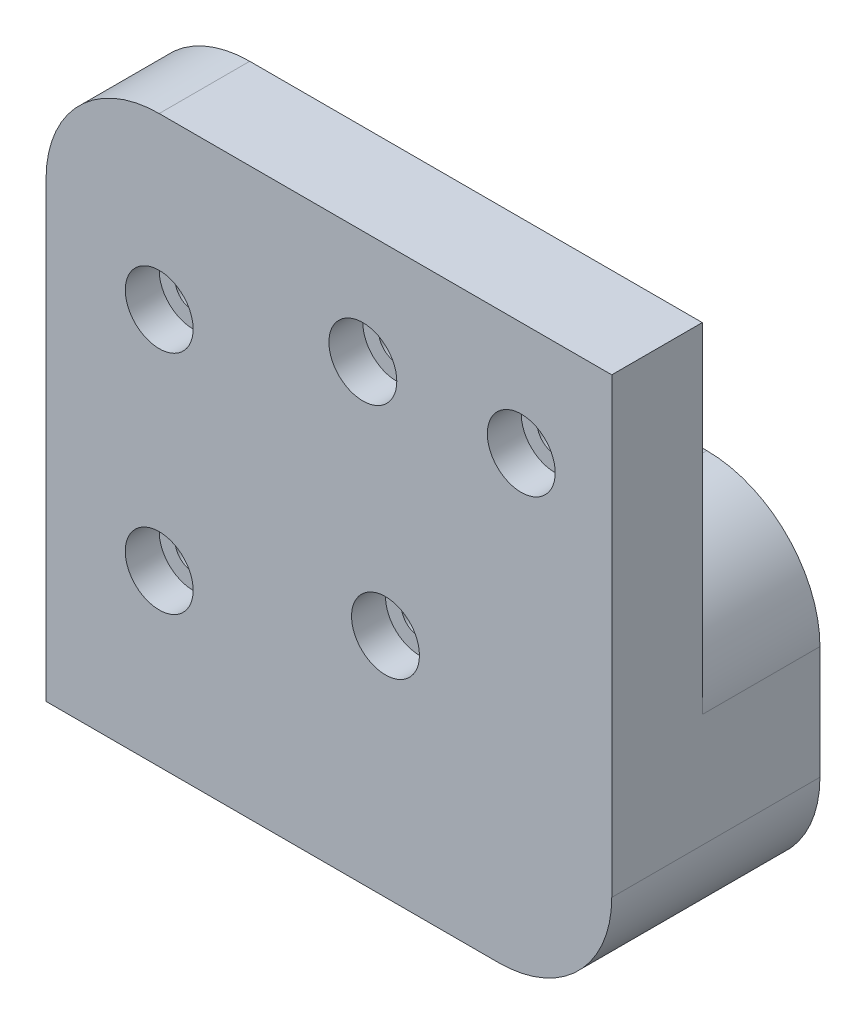
ISO-10303-21;
HEADER;
FILE_DESCRIPTION(('STEP AP214'),'2;1');
FILE_NAME('part.step','',(''),(''),'','','');
FILE_SCHEMA(('AUTOMOTIVE_DESIGN { 1 0 10303 214 1 1 1 1 }'));
ENDSEC;
DATA;
#1=APPLICATION_CONTEXT('core data for automotive mechanical design processes');
#2=APPLICATION_PROTOCOL_DEFINITION('international standard','automotive_design',2000,#1);
#3=PRODUCT_CONTEXT('',#1,'mechanical');
#4=PRODUCT('Part','Part','',(#3));
#5=PRODUCT_RELATED_PRODUCT_CATEGORY('part','',(#4));
#6=PRODUCT_DEFINITION_FORMATION('','',#4);
#7=PRODUCT_DEFINITION_CONTEXT('part definition',#1,'design');
#8=PRODUCT_DEFINITION('design','',#6,#7);
#9=PRODUCT_DEFINITION_SHAPE('','',#8);
#10=(LENGTH_UNIT() NAMED_UNIT(*) SI_UNIT(.MILLI.,.METRE.));
#11=(NAMED_UNIT(*) PLANE_ANGLE_UNIT() SI_UNIT($,.RADIAN.));
#12=(NAMED_UNIT(*) SI_UNIT($,.STERADIAN.) SOLID_ANGLE_UNIT());
#13=UNCERTAINTY_MEASURE_WITH_UNIT(LENGTH_MEASURE(1.E-05),#10,'distance_accuracy_value','');
#14=(GEOMETRIC_REPRESENTATION_CONTEXT(3) GLOBAL_UNCERTAINTY_ASSIGNED_CONTEXT((#13)) GLOBAL_UNIT_ASSIGNED_CONTEXT((#10,
#11,#12)) REPRESENTATION_CONTEXT('',''));
#15=CARTESIAN_POINT('',(0.,0.,0.));
#16=DIRECTION('',(0.,0.,1.));
#17=DIRECTION('',(1.,0.,0.));
#18=AXIS2_PLACEMENT_3D('',#15,#16,#17);
#19=CARTESIAN_POINT('',(20.,47.5288390266744,-52.8263560710908));
#20=DIRECTION('',(0.,0.,1.));
#21=DIRECTION('',(1.,0.,0.));
#22=AXIS2_PLACEMENT_3D('',#19,#20,#21);
#23=CYLINDRICAL_SURFACE('',#22,1.60000000000001);
#24=CARTESIAN_POINT('',(20.,47.5288390266744,-10.399949199898));
#25=DIRECTION('',(0.,0.,1.));
#26=DIRECTION('',(1.,0.,0.));
#27=AXIS2_PLACEMENT_3D('',#24,#25,#26);
#28=CIRCLE('',#27,1.60000000000001);
#29=CARTESIAN_POINT('',(21.6,47.5288390266744,-10.399949199898));
#30=VERTEX_POINT('',#29);
#31=EDGE_CURVE('E206',#30,#30,#28,.F.);
#32=ORIENTED_EDGE('',*,*,#31,.T.);
#33=EDGE_LOOP('',(#32));
#34=FACE_BOUND('',#33,.T.);
#35=CARTESIAN_POINT('',(20.,47.5288390266744,5.));
#36=DIRECTION('',(0.,0.,1.));
#37=DIRECTION('',(1.,0.,0.));
#38=AXIS2_PLACEMENT_3D('',#35,#36,#37);
#39=CIRCLE('',#38,1.60000000000001);
#40=CARTESIAN_POINT('',(21.6,47.5288390266744,5.));
#41=VERTEX_POINT('',#40);
#42=EDGE_CURVE('E163',#41,#41,#39,.F.);
#43=ORIENTED_EDGE('',*,*,#42,.F.);
#44=EDGE_LOOP('',(#43));
#45=FACE_BOUND('',#44,.T.);
#46=ADVANCED_FACE('F51',(#34,#45),#23,.F.);
#47=CARTESIAN_POINT('',(32.,67.5,8.));
#48=DIRECTION('',(0.,0.,-1.));
#49=DIRECTION('',(-1.,0.,0.));
#50=AXIS2_PLACEMENT_3D('',#47,#48,#49);
#51=CYLINDRICAL_SURFACE('',#50,1.6);
#52=CARTESIAN_POINT('',(32.,67.5,0.));
#53=DIRECTION('',(0.,0.,1.));
#54=DIRECTION('',(1.,0.,0.));
#55=AXIS2_PLACEMENT_3D('',#52,#53,#54);
#56=CIRCLE('',#55,1.6);
#57=CARTESIAN_POINT('',(33.6,67.5,0.));
#58=VERTEX_POINT('',#57);
#59=EDGE_CURVE('E220',#58,#58,#56,.T.);
#60=ORIENTED_EDGE('',*,*,#59,.F.);
#61=EDGE_LOOP('',(#60));
#62=FACE_BOUND('',#61,.T.);
#63=CARTESIAN_POINT('',(32.,67.5,5.));
#64=DIRECTION('',(0.,0.,1.));
#65=DIRECTION('',(1.,0.,0.));
#66=AXIS2_PLACEMENT_3D('',#63,#64,#65);
#67=CIRCLE('',#66,1.6);
#68=CARTESIAN_POINT('',(33.6,67.5,5.));
#69=VERTEX_POINT('',#68);
#70=EDGE_CURVE('E212',#69,#69,#67,.T.);
#71=ORIENTED_EDGE('',*,*,#70,.T.);
#72=EDGE_LOOP('',(#71));
#73=FACE_BOUND('',#72,.T.);
#74=ADVANCED_FACE('F384',(#62,#73),#51,.F.);
#75=CARTESIAN_POINT('',(18.,67.5,8.));
#76=DIRECTION('',(0.,0.,-1.));
#77=DIRECTION('',(-1.,0.,0.));
#78=AXIS2_PLACEMENT_3D('',#75,#76,#77);
#79=CYLINDRICAL_SURFACE('',#78,1.60000000000001);
#80=CARTESIAN_POINT('',(18.,67.5,0.));
#81=DIRECTION('',(0.,0.,1.));
#82=DIRECTION('',(1.,0.,0.));
#83=AXIS2_PLACEMENT_3D('',#80,#81,#82);
#84=CIRCLE('',#83,1.60000000000001);
#85=CARTESIAN_POINT('',(19.6,67.5,0.));
#86=VERTEX_POINT('',#85);
#87=EDGE_CURVE('E216',#86,#86,#84,.T.);
#88=ORIENTED_EDGE('',*,*,#87,.F.);
#89=EDGE_LOOP('',(#88));
#90=FACE_BOUND('',#89,.T.);
#91=CARTESIAN_POINT('',(18.,67.5,5.));
#92=DIRECTION('',(0.,0.,1.));
#93=DIRECTION('',(1.,0.,0.));
#94=AXIS2_PLACEMENT_3D('',#91,#92,#93);
#95=CIRCLE('',#94,1.60000000000001);
#96=CARTESIAN_POINT('',(19.6,67.5,5.));
#97=VERTEX_POINT('',#96);
#98=EDGE_CURVE('E272',#97,#97,#95,.T.);
#99=ORIENTED_EDGE('',*,*,#98,.T.);
#100=EDGE_LOOP('',(#99));
#101=FACE_BOUND('',#100,.T.);
#102=ADVANCED_FACE('F392',(#90,#101),#79,.F.);
#103=CARTESIAN_POINT('',(0.,62.5,8.));
#104=DIRECTION('',(0.,0.,-1.));
#105=DIRECTION('',(-1.,0.,0.));
#106=AXIS2_PLACEMENT_3D('',#103,#104,#105);
#107=CYLINDRICAL_SURFACE('',#106,1.6);
#108=CARTESIAN_POINT('',(0.,62.5,0.));
#109=DIRECTION('',(0.,0.,1.));
#110=DIRECTION('',(1.,0.,0.));
#111=AXIS2_PLACEMENT_3D('',#108,#109,#110);
#112=CIRCLE('',#111,1.6);
#113=CARTESIAN_POINT('',(1.60000000000002,62.5,0.));
#114=VERTEX_POINT('',#113);
#115=EDGE_CURVE('E211',#114,#114,#112,.T.);
#116=ORIENTED_EDGE('',*,*,#115,.F.);
#117=EDGE_LOOP('',(#116));
#118=FACE_BOUND('',#117,.T.);
#119=CARTESIAN_POINT('',(0.,62.5,5.));
#120=DIRECTION('',(0.,0.,1.));
#121=DIRECTION('',(1.,0.,0.));
#122=AXIS2_PLACEMENT_3D('',#119,#120,#121);
#123=CIRCLE('',#122,1.6);
#124=CARTESIAN_POINT('',(1.60000000000002,62.5,5.));
#125=VERTEX_POINT('',#124);
#126=EDGE_CURVE('E268',#125,#125,#123,.T.);
#127=ORIENTED_EDGE('',*,*,#126,.T.);
#128=EDGE_LOOP('',(#127));
#129=FACE_BOUND('',#128,.T.);
#130=ADVANCED_FACE('F427',(#118,#129),#107,.F.);
#131=CARTESIAN_POINT('',(0.,42.5,8.));
#132=DIRECTION('',(0.,0.,-1.));
#133=DIRECTION('',(-1.,0.,0.));
#134=AXIS2_PLACEMENT_3D('',#131,#132,#133);
#135=CYLINDRICAL_SURFACE('',#134,1.6);
#136=CARTESIAN_POINT('',(0.,42.5,0.));
#137=DIRECTION('',(0.,0.,1.));
#138=DIRECTION('',(1.,0.,0.));
#139=AXIS2_PLACEMENT_3D('',#136,#137,#138);
#140=CIRCLE('',#139,1.6);
#141=CARTESIAN_POINT('',(1.60000000000002,42.5,0.));
#142=VERTEX_POINT('',#141);
#143=EDGE_CURVE('E207',#142,#142,#140,.T.);
#144=ORIENTED_EDGE('',*,*,#143,.F.);
#145=EDGE_LOOP('',(#144));
#146=FACE_BOUND('',#145,.T.);
#147=CARTESIAN_POINT('',(0.,42.5,5.));
#148=DIRECTION('',(0.,0.,1.));
#149=DIRECTION('',(1.,0.,0.));
#150=AXIS2_PLACEMENT_3D('',#147,#148,#149);
#151=CIRCLE('',#150,1.6);
#152=CARTESIAN_POINT('',(1.60000000000002,42.5,5.));
#153=VERTEX_POINT('',#152);
#154=EDGE_CURVE('E177',#153,#153,#151,.T.);
#155=ORIENTED_EDGE('',*,*,#154,.T.);
#156=EDGE_LOOP('',(#155));
#157=FACE_BOUND('',#156,.T.);
#158=ADVANCED_FACE('F354',(#146,#157),#135,.F.);
#159=CARTESIAN_POINT('',(0.,0.,8.));
#160=DIRECTION('',(0.,0.,-1.));
#161=DIRECTION('',(-1.,0.,0.));
#162=AXIS2_PLACEMENT_3D('',#159,#160,#161);
#163=PLANE('',#162);
#164=CARTESIAN_POINT('',(20.,47.5288390266744,8.));
#165=DIRECTION('',(0.,0.,1.));
#166=DIRECTION('',(1.,0.,0.));
#167=AXIS2_PLACEMENT_3D('',#164,#165,#166);
#168=CIRCLE('',#167,3.);
#169=CARTESIAN_POINT('',(23.,47.5288390266744,8.));
#170=VERTEX_POINT('',#169);
#171=EDGE_CURVE('E336',#170,#170,#168,.T.);
#172=ORIENTED_EDGE('',*,*,#171,.F.);
#173=EDGE_LOOP('',(#172));
#174=FACE_BOUND('',#173,.T.);
#175=DIRECTION('',(1.,0.,0.));
#176=VECTOR('',#175,1.);
#177=CARTESIAN_POINT('',(10.,27.5,8.));
#178=LINE('',#177,#176);
#179=CARTESIAN_POINT('',(-9.99999999999999,27.5,8.));
#180=VERTEX_POINT('',#179);
#181=CARTESIAN_POINT('',(30.,27.5,8.));
#182=VERTEX_POINT('',#181);
#183=EDGE_CURVE('E228',#180,#182,#178,.T.);
#184=ORIENTED_EDGE('',*,*,#183,.T.);
#185=CARTESIAN_POINT('',(30.,37.5,8.));
#186=DIRECTION('',(0.,0.,-1.));
#187=DIRECTION('',(-1.,0.,0.));
#188=AXIS2_PLACEMENT_3D('',#185,#186,#187);
#189=CIRCLE('',#188,10.);
#190=CARTESIAN_POINT('',(40.,37.5,8.));
#191=VERTEX_POINT('',#190);
#192=EDGE_CURVE('E313',#182,#191,#189,.F.);
#193=ORIENTED_EDGE('',*,*,#192,.T.);
#194=DIRECTION('',(0.,1.,0.));
#195=VECTOR('',#194,1.);
#196=CARTESIAN_POINT('',(40.,77.5,8.));
#197=LINE('',#196,#195);
#198=CARTESIAN_POINT('',(40.,77.5,8.));
#199=VERTEX_POINT('',#198);
#200=EDGE_CURVE('E233',#191,#199,#197,.T.);
#201=ORIENTED_EDGE('',*,*,#200,.T.);
#202=DIRECTION('',(-1.,0.,0.));
#203=VECTOR('',#202,1.);
#204=CARTESIAN_POINT('',(-9.99999999999999,77.5,8.));
#205=LINE('',#204,#203);
#206=CARTESIAN_POINT('',(0.,77.5,8.));
#207=VERTEX_POINT('',#206);
#208=EDGE_CURVE('E236',#199,#207,#205,.T.);
#209=ORIENTED_EDGE('',*,*,#208,.T.);
#210=CARTESIAN_POINT('',(0.,67.5,8.));
#211=DIRECTION('',(0.,0.,-1.));
#212=DIRECTION('',(-1.,0.,0.));
#213=AXIS2_PLACEMENT_3D('',#210,#211,#212);
#214=CIRCLE('',#213,10.);
#215=CARTESIAN_POINT('',(-9.99999999999999,67.5,8.));
#216=VERTEX_POINT('',#215);
#217=EDGE_CURVE('E288',#207,#216,#214,.F.);
#218=ORIENTED_EDGE('',*,*,#217,.T.);
#219=DIRECTION('',(0.,-1.,0.));
#220=VECTOR('',#219,1.);
#221=CARTESIAN_POINT('',(-9.99999999999999,77.5,8.));
#222=LINE('',#221,#220);
#223=EDGE_CURVE('E225',#216,#180,#222,.T.);
#224=ORIENTED_EDGE('',*,*,#223,.T.);
#225=EDGE_LOOP('',(#184,#193,#201,#209,#218,#224));
#226=FACE_BOUND('',#225,.T.);
#227=CARTESIAN_POINT('',(32.,67.5,8.));
#228=DIRECTION('',(0.,0.,1.));
#229=DIRECTION('',(1.,0.,0.));
#230=AXIS2_PLACEMENT_3D('',#227,#228,#229);
#231=CIRCLE('',#230,3.);
#232=CARTESIAN_POINT('',(35.,67.5,8.));
#233=VERTEX_POINT('',#232);
#234=EDGE_CURVE('E178',#233,#233,#231,.T.);
#235=ORIENTED_EDGE('',*,*,#234,.F.);
#236=EDGE_LOOP('',(#235));
#237=FACE_BOUND('',#236,.T.);
#238=CARTESIAN_POINT('',(18.,67.5,8.));
#239=DIRECTION('',(0.,0.,1.));
#240=DIRECTION('',(1.,0.,0.));
#241=AXIS2_PLACEMENT_3D('',#238,#239,#240);
#242=CIRCLE('',#241,3.);
#243=CARTESIAN_POINT('',(21.,67.5,8.));
#244=VERTEX_POINT('',#243);
#245=EDGE_CURVE('E182',#244,#244,#242,.T.);
#246=ORIENTED_EDGE('',*,*,#245,.F.);
#247=EDGE_LOOP('',(#246));
#248=FACE_BOUND('',#247,.T.);
#249=CARTESIAN_POINT('',(0.,62.5,8.));
#250=DIRECTION('',(0.,0.,1.));
#251=DIRECTION('',(1.,0.,0.));
#252=AXIS2_PLACEMENT_3D('',#249,#250,#251);
#253=CIRCLE('',#252,3.);
#254=CARTESIAN_POINT('',(3.00000000000002,62.5,8.));
#255=VERTEX_POINT('',#254);
#256=EDGE_CURVE('E190',#255,#255,#253,.T.);
#257=ORIENTED_EDGE('',*,*,#256,.F.);
#258=EDGE_LOOP('',(#257));
#259=FACE_BOUND('',#258,.T.);
#260=CARTESIAN_POINT('',(0.,42.5,8.));
#261=DIRECTION('',(0.,0.,1.));
#262=DIRECTION('',(1.,0.,0.));
#263=AXIS2_PLACEMENT_3D('',#260,#261,#262);
#264=CIRCLE('',#263,3.);
#265=CARTESIAN_POINT('',(3.00000000000002,42.5,8.));
#266=VERTEX_POINT('',#265);
#267=EDGE_CURVE('E198',#266,#266,#264,.T.);
#268=ORIENTED_EDGE('',*,*,#267,.F.);
#269=EDGE_LOOP('',(#268));
#270=FACE_BOUND('',#269,.T.);
#271=ADVANCED_FACE('F351',(#174,#226,#237,#248,#259,#270),#163,.F.);
#272=CARTESIAN_POINT('',(0.,0.,0.));
#273=DIRECTION('',(0.,0.,-1.));
#274=DIRECTION('',(-1.,0.,0.));
#275=AXIS2_PLACEMENT_3D('',#272,#273,#274);
#276=PLANE('',#275);
#277=ORIENTED_EDGE('',*,*,#115,.T.);
#278=EDGE_LOOP('',(#277));
#279=FACE_BOUND('',#278,.T.);
#280=ORIENTED_EDGE('',*,*,#59,.T.);
#281=EDGE_LOOP('',(#280));
#282=FACE_BOUND('',#281,.T.);
#283=DIRECTION('',(0.,-1.,0.));
#284=VECTOR('',#283,1.);
#285=CARTESIAN_POINT('',(-9.99999999999999,77.5,0.));
#286=LINE('',#285,#284);
#287=CARTESIAN_POINT('',(-9.99999999999999,67.5,0.));
#288=VERTEX_POINT('',#287);
#289=CARTESIAN_POINT('',(-9.99999999999999,27.5,0.));
#290=VERTEX_POINT('',#289);
#291=EDGE_CURVE('E224',#288,#290,#286,.T.);
#292=ORIENTED_EDGE('',*,*,#291,.F.);
#293=CARTESIAN_POINT('',(0.,67.5,0.));
#294=DIRECTION('',(0.,0.,-1.));
#295=DIRECTION('',(-1.,0.,0.));
#296=AXIS2_PLACEMENT_3D('',#293,#294,#295);
#297=CIRCLE('',#296,10.);
#298=CARTESIAN_POINT('',(0.,77.5,0.));
#299=VERTEX_POINT('',#298);
#300=EDGE_CURVE('E282',#288,#299,#297,.T.);
#301=ORIENTED_EDGE('',*,*,#300,.T.);
#302=DIRECTION('',(-1.,0.,0.));
#303=VECTOR('',#302,1.);
#304=CARTESIAN_POINT('',(-9.99999999999999,77.5,0.));
#305=LINE('',#304,#303);
#306=CARTESIAN_POINT('',(40.,77.5,0.));
#307=VERTEX_POINT('',#306);
#308=EDGE_CURVE('E229',#307,#299,#305,.T.);
#309=ORIENTED_EDGE('',*,*,#308,.F.);
#310=DIRECTION('',(0.,1.,0.));
#311=VECTOR('',#310,1.);
#312=CARTESIAN_POINT('',(40.,77.5,0.));
#313=LINE('',#312,#311);
#314=CARTESIAN_POINT('',(40.,47.5,0.));
#315=VERTEX_POINT('',#314);
#316=EDGE_CURVE('E69',#315,#307,#313,.T.);
#317=ORIENTED_EDGE('',*,*,#316,.F.);
#318=CARTESIAN_POINT('',(30.,47.5,0.));
#319=DIRECTION('',(0.,0.,-1.));
#320=DIRECTION('',(-1.,0.,0.));
#321=AXIS2_PLACEMENT_3D('',#318,#319,#320);
#322=CIRCLE('',#321,10.);
#323=CARTESIAN_POINT('',(30.,57.5,0.));
#324=VERTEX_POINT('',#323);
#325=EDGE_CURVE('E11',#315,#324,#322,.F.);
#326=ORIENTED_EDGE('',*,*,#325,.T.);
#327=DIRECTION('',(1.,0.,0.));
#328=VECTOR('',#327,1.);
#329=CARTESIAN_POINT('',(10.,57.5,0.));
#330=LINE('',#329,#328);
#331=CARTESIAN_POINT('',(20.,57.5,0.));
#332=VERTEX_POINT('',#331);
#333=EDGE_CURVE('E249',#332,#324,#330,.T.);
#334=ORIENTED_EDGE('',*,*,#333,.F.);
#335=CARTESIAN_POINT('',(20.,47.5,0.));
#336=DIRECTION('',(0.,0.,-1.));
#337=DIRECTION('',(-1.,0.,0.));
#338=AXIS2_PLACEMENT_3D('',#335,#336,#337);
#339=CIRCLE('',#338,10.);
#340=CARTESIAN_POINT('',(10.,47.5,0.));
#341=VERTEX_POINT('',#340);
#342=EDGE_CURVE('E161',#332,#341,#339,.F.);
#343=ORIENTED_EDGE('',*,*,#342,.T.);
#344=DIRECTION('',(0.,1.,0.));
#345=VECTOR('',#344,1.);
#346=CARTESIAN_POINT('',(10.,57.5,0.));
#347=LINE('',#346,#345);
#348=CARTESIAN_POINT('',(10.,37.5,0.));
#349=VERTEX_POINT('',#348);
#350=EDGE_CURVE('E246',#349,#341,#347,.T.);
#351=ORIENTED_EDGE('',*,*,#350,.F.);
#352=CARTESIAN_POINT('',(20.,37.5,0.));
#353=DIRECTION('',(0.,0.,-1.));
#354=DIRECTION('',(-1.,0.,0.));
#355=AXIS2_PLACEMENT_3D('',#352,#353,#354);
#356=CIRCLE('',#355,10.);
#357=CARTESIAN_POINT('',(20.,27.5,0.));
#358=VERTEX_POINT('',#357);
#359=EDGE_CURVE('E59',#349,#358,#356,.F.);
#360=ORIENTED_EDGE('',*,*,#359,.T.);
#361=DIRECTION('',(1.,0.,0.));
#362=VECTOR('',#361,1.);
#363=CARTESIAN_POINT('',(10.,27.5,0.));
#364=LINE('',#363,#362);
#365=EDGE_CURVE('E243',#290,#358,#364,.T.);
#366=ORIENTED_EDGE('',*,*,#365,.F.);
#367=EDGE_LOOP('',(#292,#301,#309,#317,#326,#334,#343,#351,#360,#366));
#368=FACE_BOUND('',#367,.T.);
#369=ORIENTED_EDGE('',*,*,#87,.T.);
#370=EDGE_LOOP('',(#369));
#371=FACE_BOUND('',#370,.T.);
#372=ORIENTED_EDGE('',*,*,#143,.T.);
#373=EDGE_LOOP('',(#372));
#374=FACE_BOUND('',#373,.T.);
#375=ADVANCED_FACE('F319',(#279,#282,#368,#371,#374),#276,.T.);
#376=CARTESIAN_POINT('',(-9.99999999999999,77.5,8.));
#377=DIRECTION('',(1.,0.,0.));
#378=DIRECTION('',(0.,1.,0.));
#379=AXIS2_PLACEMENT_3D('',#376,#377,#378);
#380=PLANE('',#379);
#381=ORIENTED_EDGE('',*,*,#223,.F.);
#382=DIRECTION('',(0.,0.,-1.));
#383=VECTOR('',#382,1.);
#384=CARTESIAN_POINT('',(-9.99999999999999,67.5,8.));
#385=LINE('',#384,#383);
#386=EDGE_CURVE('E264',#216,#288,#385,.T.);
#387=ORIENTED_EDGE('',*,*,#386,.T.);
#388=ORIENTED_EDGE('',*,*,#291,.T.);
#389=DIRECTION('',(0.,0.,-1.));
#390=VECTOR('',#389,1.);
#391=CARTESIAN_POINT('',(-9.99999999999999,27.5,8.));
#392=LINE('',#391,#390);
#393=EDGE_CURVE('E260',#180,#290,#392,.T.);
#394=ORIENTED_EDGE('',*,*,#393,.F.);
#395=EDGE_LOOP('',(#381,#387,#388,#394));
#396=FACE_BOUND('',#395,.T.);
#397=ADVANCED_FACE('F441',(#396),#380,.F.);
#398=CARTESIAN_POINT('',(10.,27.5,8.));
#399=DIRECTION('',(0.,1.,0.));
#400=DIRECTION('',(0.,0.,1.));
#401=AXIS2_PLACEMENT_3D('',#398,#399,#400);
#402=PLANE('',#401);
#403=ORIENTED_EDGE('',*,*,#365,.T.);
#404=DIRECTION('',(0.,0.,1.));
#405=VECTOR('',#404,1.);
#406=CARTESIAN_POINT('',(20.,27.5,8.));
#407=LINE('',#406,#405);
#408=CARTESIAN_POINT('',(20.,27.5,-10.399949199898));
#409=VERTEX_POINT('',#408);
#410=EDGE_CURVE('E299',#358,#409,#407,.F.);
#411=ORIENTED_EDGE('',*,*,#410,.T.);
#412=DIRECTION('',(1.,0.,0.));
#413=VECTOR('',#412,1.);
#414=CARTESIAN_POINT('',(0.,27.5,-10.399949199898));
#415=LINE('',#414,#413);
#416=CARTESIAN_POINT('',(30.,27.5,-10.399949199898));
#417=VERTEX_POINT('',#416);
#418=EDGE_CURVE('E328',#409,#417,#415,.T.);
#419=ORIENTED_EDGE('',*,*,#418,.T.);
#420=DIRECTION('',(0.,0.,1.));
#421=VECTOR('',#420,1.);
#422=CARTESIAN_POINT('',(30.,27.5,8.));
#423=LINE('',#422,#421);
#424=EDGE_CURVE('E296',#417,#182,#423,.T.);
#425=ORIENTED_EDGE('',*,*,#424,.T.);
#426=ORIENTED_EDGE('',*,*,#183,.F.);
#427=ORIENTED_EDGE('',*,*,#393,.T.);
#428=EDGE_LOOP('',(#403,#411,#419,#425,#426,#427));
#429=FACE_BOUND('',#428,.T.);
#430=ADVANCED_FACE('F327',(#429),#402,.F.);
#431=CARTESIAN_POINT('',(40.,77.5,8.));
#432=DIRECTION('',(-1.,0.,0.));
#433=DIRECTION('',(0.,0.,1.));
#434=AXIS2_PLACEMENT_3D('',#431,#432,#433);
#435=PLANE('',#434);
#436=DIRECTION('',(0.,1.,0.));
#437=VECTOR('',#436,1.);
#438=CARTESIAN_POINT('',(40.,0.,-10.399949199898));
#439=LINE('',#438,#437);
#440=CARTESIAN_POINT('',(40.,37.5,-10.399949199898));
#441=VERTEX_POINT('',#440);
#442=CARTESIAN_POINT('',(40.,47.5,-10.399949199898));
#443=VERTEX_POINT('',#442);
#444=EDGE_CURVE('E147',#441,#443,#439,.T.);
#445=ORIENTED_EDGE('',*,*,#444,.T.);
#446=DIRECTION('',(0.,0.,1.));
#447=VECTOR('',#446,1.);
#448=CARTESIAN_POINT('',(40.,47.5,8.));
#449=LINE('',#448,#447);
#450=EDGE_CURVE('E309',#443,#315,#449,.T.);
#451=ORIENTED_EDGE('',*,*,#450,.T.);
#452=ORIENTED_EDGE('',*,*,#316,.T.);
#453=DIRECTION('',(0.,0.,-1.));
#454=VECTOR('',#453,1.);
#455=CARTESIAN_POINT('',(40.,77.5,8.));
#456=LINE('',#455,#454);
#457=EDGE_CURVE('E240',#199,#307,#456,.T.);
#458=ORIENTED_EDGE('',*,*,#457,.F.);
#459=ORIENTED_EDGE('',*,*,#200,.F.);
#460=DIRECTION('',(0.,0.,1.));
#461=VECTOR('',#460,1.);
#462=CARTESIAN_POINT('',(40.,37.5,8.));
#463=LINE('',#462,#461);
#464=EDGE_CURVE('E307',#191,#441,#463,.F.);
#465=ORIENTED_EDGE('',*,*,#464,.T.);
#466=EDGE_LOOP('',(#445,#451,#452,#458,#459,#465));
#467=FACE_BOUND('',#466,.T.);
#468=ADVANCED_FACE('F378',(#467),#435,.F.);
#469=CARTESIAN_POINT('',(-9.99999999999999,77.5,8.));
#470=DIRECTION('',(0.,-1.,0.));
#471=DIRECTION('',(0.,0.,-1.));
#472=AXIS2_PLACEMENT_3D('',#469,#470,#471);
#473=PLANE('',#472);
#474=ORIENTED_EDGE('',*,*,#308,.T.);
#475=DIRECTION('',(0.,0.,-1.));
#476=VECTOR('',#475,1.);
#477=CARTESIAN_POINT('',(0.,77.5,8.));
#478=LINE('',#477,#476);
#479=EDGE_CURVE('E285',#299,#207,#478,.F.);
#480=ORIENTED_EDGE('',*,*,#479,.T.);
#481=ORIENTED_EDGE('',*,*,#208,.F.);
#482=ORIENTED_EDGE('',*,*,#457,.T.);
#483=EDGE_LOOP('',(#474,#480,#481,#482));
#484=FACE_BOUND('',#483,.T.);
#485=ADVANCED_FACE('F369',(#484),#473,.F.);
#486=CARTESIAN_POINT('',(0.,42.5,5.));
#487=DIRECTION('',(0.,0.,1.));
#488=DIRECTION('',(1.,0.,0.));
#489=AXIS2_PLACEMENT_3D('',#486,#487,#488);
#490=CYLINDRICAL_SURFACE('',#489,3.);
#491=CARTESIAN_POINT('',(0.,42.5,5.));
#492=DIRECTION('',(0.,0.,1.));
#493=DIRECTION('',(1.,0.,0.));
#494=AXIS2_PLACEMENT_3D('',#491,#492,#493);
#495=CIRCLE('',#494,3.);
#496=CARTESIAN_POINT('',(3.00000000000002,42.5,5.));
#497=VERTEX_POINT('',#496);
#498=EDGE_CURVE('E202',#497,#497,#495,.T.);
#499=ORIENTED_EDGE('',*,*,#498,.F.);
#500=EDGE_LOOP('',(#499));
#501=FACE_BOUND('',#500,.T.);
#502=ORIENTED_EDGE('',*,*,#267,.T.);
#503=EDGE_LOOP('',(#502));
#504=FACE_BOUND('',#503,.T.);
#505=ADVANCED_FACE('F366',(#501,#504),#490,.F.);
#506=CARTESIAN_POINT('',(0.,42.5,5.));
#507=DIRECTION('',(0.,0.,1.));
#508=DIRECTION('',(1.,0.,0.));
#509=AXIS2_PLACEMENT_3D('',#506,#507,#508);
#510=PLANE('',#509);
#511=ORIENTED_EDGE('',*,*,#154,.F.);
#512=EDGE_LOOP('',(#511));
#513=FACE_BOUND('',#512,.T.);
#514=ORIENTED_EDGE('',*,*,#498,.T.);
#515=EDGE_LOOP('',(#514));
#516=FACE_BOUND('',#515,.T.);
#517=ADVANCED_FACE('F368',(#513,#516),#510,.T.);
#518=CARTESIAN_POINT('',(0.,62.5,5.));
#519=DIRECTION('',(0.,0.,1.));
#520=DIRECTION('',(1.,0.,0.));
#521=AXIS2_PLACEMENT_3D('',#518,#519,#520);
#522=CYLINDRICAL_SURFACE('',#521,3.);
#523=CARTESIAN_POINT('',(0.,62.5,5.));
#524=DIRECTION('',(0.,0.,1.));
#525=DIRECTION('',(1.,0.,0.));
#526=AXIS2_PLACEMENT_3D('',#523,#524,#525);
#527=CIRCLE('',#526,3.);
#528=CARTESIAN_POINT('',(3.00000000000002,62.5,5.));
#529=VERTEX_POINT('',#528);
#530=EDGE_CURVE('E194',#529,#529,#527,.T.);
#531=ORIENTED_EDGE('',*,*,#530,.F.);
#532=EDGE_LOOP('',(#531));
#533=FACE_BOUND('',#532,.T.);
#534=ORIENTED_EDGE('',*,*,#256,.T.);
#535=EDGE_LOOP('',(#534));
#536=FACE_BOUND('',#535,.T.);
#537=ADVANCED_FACE('F375',(#533,#536),#522,.F.);
#538=CARTESIAN_POINT('',(0.,62.5,5.));
#539=DIRECTION('',(0.,0.,1.));
#540=DIRECTION('',(1.,0.,0.));
#541=AXIS2_PLACEMENT_3D('',#538,#539,#540);
#542=PLANE('',#541);
#543=ORIENTED_EDGE('',*,*,#126,.F.);
#544=EDGE_LOOP('',(#543));
#545=FACE_BOUND('',#544,.T.);
#546=ORIENTED_EDGE('',*,*,#530,.T.);
#547=EDGE_LOOP('',(#546));
#548=FACE_BOUND('',#547,.T.);
#549=ADVANCED_FACE('F412',(#545,#548),#542,.T.);
#550=CARTESIAN_POINT('',(18.,67.5,5.));
#551=DIRECTION('',(0.,0.,1.));
#552=DIRECTION('',(1.,0.,0.));
#553=AXIS2_PLACEMENT_3D('',#550,#551,#552);
#554=CYLINDRICAL_SURFACE('',#553,3.);
#555=CARTESIAN_POINT('',(18.,67.5,5.));
#556=DIRECTION('',(0.,0.,1.));
#557=DIRECTION('',(1.,0.,0.));
#558=AXIS2_PLACEMENT_3D('',#555,#556,#557);
#559=CIRCLE('',#558,3.);
#560=CARTESIAN_POINT('',(21.,67.5,5.));
#561=VERTEX_POINT('',#560);
#562=EDGE_CURVE('E186',#561,#561,#559,.T.);
#563=ORIENTED_EDGE('',*,*,#562,.F.);
#564=EDGE_LOOP('',(#563));
#565=FACE_BOUND('',#564,.T.);
#566=ORIENTED_EDGE('',*,*,#245,.T.);
#567=EDGE_LOOP('',(#566));
#568=FACE_BOUND('',#567,.T.);
#569=ADVANCED_FACE('F409',(#565,#568),#554,.F.);
#570=CARTESIAN_POINT('',(18.,67.5,5.));
#571=DIRECTION('',(0.,0.,1.));
#572=DIRECTION('',(1.,0.,0.));
#573=AXIS2_PLACEMENT_3D('',#570,#571,#572);
#574=PLANE('',#573);
#575=ORIENTED_EDGE('',*,*,#98,.F.);
#576=EDGE_LOOP('',(#575));
#577=FACE_BOUND('',#576,.T.);
#578=ORIENTED_EDGE('',*,*,#562,.T.);
#579=EDGE_LOOP('',(#578));
#580=FACE_BOUND('',#579,.T.);
#581=ADVANCED_FACE('F407',(#577,#580),#574,.T.);
#582=CARTESIAN_POINT('',(32.,67.5,5.));
#583=DIRECTION('',(0.,0.,1.));
#584=DIRECTION('',(1.,0.,0.));
#585=AXIS2_PLACEMENT_3D('',#582,#583,#584);
#586=CYLINDRICAL_SURFACE('',#585,3.);
#587=CARTESIAN_POINT('',(32.,67.5,5.));
#588=DIRECTION('',(0.,0.,1.));
#589=DIRECTION('',(1.,0.,0.));
#590=AXIS2_PLACEMENT_3D('',#587,#588,#589);
#591=CIRCLE('',#590,3.);
#592=CARTESIAN_POINT('',(35.,67.5,5.));
#593=VERTEX_POINT('',#592);
#594=EDGE_CURVE('E173',#593,#593,#591,.T.);
#595=ORIENTED_EDGE('',*,*,#594,.F.);
#596=EDGE_LOOP('',(#595));
#597=FACE_BOUND('',#596,.T.);
#598=ORIENTED_EDGE('',*,*,#234,.T.);
#599=EDGE_LOOP('',(#598));
#600=FACE_BOUND('',#599,.T.);
#601=ADVANCED_FACE('F403',(#597,#600),#586,.F.);
#602=CARTESIAN_POINT('',(32.,67.5,5.));
#603=DIRECTION('',(0.,0.,1.));
#604=DIRECTION('',(1.,0.,0.));
#605=AXIS2_PLACEMENT_3D('',#602,#603,#604);
#606=PLANE('',#605);
#607=ORIENTED_EDGE('',*,*,#70,.F.);
#608=EDGE_LOOP('',(#607));
#609=FACE_BOUND('',#608,.T.);
#610=ORIENTED_EDGE('',*,*,#594,.T.);
#611=EDGE_LOOP('',(#610));
#612=FACE_BOUND('',#611,.T.);
#613=ADVANCED_FACE('F399',(#609,#612),#606,.T.);
#614=CARTESIAN_POINT('',(0.,67.5,8.));
#615=DIRECTION('',(0.,0.,-1.));
#616=DIRECTION('',(-1.,0.,0.));
#617=AXIS2_PLACEMENT_3D('',#614,#615,#616);
#618=CYLINDRICAL_SURFACE('',#617,10.);
#619=ORIENTED_EDGE('',*,*,#217,.F.);
#620=ORIENTED_EDGE('',*,*,#479,.F.);
#621=ORIENTED_EDGE('',*,*,#300,.F.);
#622=ORIENTED_EDGE('',*,*,#386,.F.);
#623=EDGE_LOOP('',(#619,#620,#621,#622));
#624=FACE_BOUND('',#623,.T.);
#625=ADVANCED_FACE('F402',(#624),#618,.T.);
#626=CARTESIAN_POINT('',(0.,57.5,-52.8263560710908));
#627=DIRECTION('',(0.,-1.,0.));
#628=DIRECTION('',(0.,0.,-1.));
#629=AXIS2_PLACEMENT_3D('',#626,#627,#628);
#630=PLANE('',#629);
#631=ORIENTED_EDGE('',*,*,#333,.T.);
#632=DIRECTION('',(0.,0.,1.));
#633=VECTOR('',#632,1.);
#634=CARTESIAN_POINT('',(30.,57.5,-52.8263560710908));
#635=LINE('',#634,#633);
#636=CARTESIAN_POINT('',(30.,57.5,-10.399949199898));
#637=VERTEX_POINT('',#636);
#638=EDGE_CURVE('E143',#324,#637,#635,.F.);
#639=ORIENTED_EDGE('',*,*,#638,.T.);
#640=DIRECTION('',(-1.,0.,0.));
#641=VECTOR('',#640,1.);
#642=CARTESIAN_POINT('',(0.,57.5,-10.399949199898));
#643=LINE('',#642,#641);
#644=CARTESIAN_POINT('',(20.,57.5,-10.399949199898));
#645=VERTEX_POINT('',#644);
#646=EDGE_CURVE('E137',#637,#645,#643,.T.);
#647=ORIENTED_EDGE('',*,*,#646,.T.);
#648=DIRECTION('',(0.,0.,1.));
#649=VECTOR('',#648,1.);
#650=CARTESIAN_POINT('',(20.,57.5,-52.8263560710908));
#651=LINE('',#650,#649);
#652=EDGE_CURVE('E141',#645,#332,#651,.T.);
#653=ORIENTED_EDGE('',*,*,#652,.T.);
#654=EDGE_LOOP('',(#631,#639,#647,#653));
#655=FACE_BOUND('',#654,.T.);
#656=ADVANCED_FACE('F139',(#655),#630,.F.);
#657=CARTESIAN_POINT('',(20.,47.5,-52.8263560710908));
#658=DIRECTION('',(0.,0.,1.));
#659=DIRECTION('',(1.,0.,0.));
#660=AXIS2_PLACEMENT_3D('',#657,#658,#659);
#661=CYLINDRICAL_SURFACE('',#660,10.);
#662=ORIENTED_EDGE('',*,*,#342,.F.);
#663=ORIENTED_EDGE('',*,*,#652,.F.);
#664=CARTESIAN_POINT('',(20.,47.5,-10.399949199898));
#665=DIRECTION('',(0.,0.,1.));
#666=DIRECTION('',(1.,0.,0.));
#667=AXIS2_PLACEMENT_3D('',#664,#665,#666);
#668=CIRCLE('',#667,10.);
#669=CARTESIAN_POINT('',(10.,47.5,-10.399949199898));
#670=VERTEX_POINT('',#669);
#671=EDGE_CURVE('E146',#645,#670,#668,.T.);
#672=ORIENTED_EDGE('',*,*,#671,.T.);
#673=DIRECTION('',(0.,0.,1.));
#674=VECTOR('',#673,1.);
#675=CARTESIAN_POINT('',(10.,47.5,-52.8263560710908));
#676=LINE('',#675,#674);
#677=EDGE_CURVE('E162',#670,#341,#676,.T.);
#678=ORIENTED_EDGE('',*,*,#677,.T.);
#679=EDGE_LOOP('',(#662,#663,#672,#678));
#680=FACE_BOUND('',#679,.T.);
#681=ADVANCED_FACE('F159',(#680),#661,.T.);
#682=CARTESIAN_POINT('',(10.,0.,-52.8263560710908));
#683=DIRECTION('',(1.,0.,0.));
#684=DIRECTION('',(0.,1.,0.));
#685=AXIS2_PLACEMENT_3D('',#682,#683,#684);
#686=PLANE('',#685);
#687=DIRECTION('',(0.,-1.,0.));
#688=VECTOR('',#687,1.);
#689=CARTESIAN_POINT('',(10.,0.,-10.399949199898));
#690=LINE('',#689,#688);
#691=CARTESIAN_POINT('',(10.,37.5,-10.399949199898));
#692=VERTEX_POINT('',#691);
#693=EDGE_CURVE('E154',#670,#692,#690,.T.);
#694=ORIENTED_EDGE('',*,*,#693,.T.);
#695=DIRECTION('',(0.,0.,1.));
#696=VECTOR('',#695,1.);
#697=CARTESIAN_POINT('',(10.,37.5,-52.8263560710908));
#698=LINE('',#697,#696);
#699=EDGE_CURVE('E292',#692,#349,#698,.T.);
#700=ORIENTED_EDGE('',*,*,#699,.T.);
#701=ORIENTED_EDGE('',*,*,#350,.T.);
#702=ORIENTED_EDGE('',*,*,#677,.F.);
#703=EDGE_LOOP('',(#694,#700,#701,#702));
#704=FACE_BOUND('',#703,.T.);
#705=ADVANCED_FACE('F512',(#704),#686,.F.);
#706=CARTESIAN_POINT('',(131.373730251444,-9.92262591848698,-10.399949199898));
#707=DIRECTION('',(0.,0.,1.));
#708=DIRECTION('',(0.,-1.,0.));
#709=AXIS2_PLACEMENT_3D('',#706,#707,#708);
#710=PLANE('',#709);
#711=ORIENTED_EDGE('',*,*,#418,.F.);
#712=CARTESIAN_POINT('',(20.,37.5,-10.399949199898));
#713=DIRECTION('',(0.,0.,1.));
#714=DIRECTION('',(1.,0.,0.));
#715=AXIS2_PLACEMENT_3D('',#712,#713,#714);
#716=CIRCLE('',#715,10.);
#717=EDGE_CURVE('E305',#409,#692,#716,.F.);
#718=ORIENTED_EDGE('',*,*,#717,.T.);
#719=ORIENTED_EDGE('',*,*,#693,.F.);
#720=ORIENTED_EDGE('',*,*,#671,.F.);
#721=ORIENTED_EDGE('',*,*,#646,.F.);
#722=CARTESIAN_POINT('',(30.,47.5,-10.399949199898));
#723=DIRECTION('',(0.,0.,1.));
#724=DIRECTION('',(1.,0.,0.));
#725=AXIS2_PLACEMENT_3D('',#722,#723,#724);
#726=CIRCLE('',#725,10.);
#727=EDGE_CURVE('E303',#637,#443,#726,.F.);
#728=ORIENTED_EDGE('',*,*,#727,.T.);
#729=ORIENTED_EDGE('',*,*,#444,.F.);
#730=CARTESIAN_POINT('',(30.,37.5,-10.399949199898));
#731=DIRECTION('',(0.,0.,1.));
#732=DIRECTION('',(1.,0.,0.));
#733=AXIS2_PLACEMENT_3D('',#730,#731,#732);
#734=CIRCLE('',#733,10.);
#735=EDGE_CURVE('E301',#441,#417,#734,.F.);
#736=ORIENTED_EDGE('',*,*,#735,.T.);
#737=EDGE_LOOP('',(#711,#718,#719,#720,#721,#728,#729,#736));
#738=FACE_BOUND('',#737,.T.);
#739=ORIENTED_EDGE('',*,*,#31,.F.);
#740=EDGE_LOOP('',(#739));
#741=FACE_BOUND('',#740,.T.);
#742=ADVANCED_FACE('F151',(#738,#741),#710,.F.);
#743=CARTESIAN_POINT('',(20.,47.5288390266744,5.));
#744=DIRECTION('',(0.,0.,1.));
#745=DIRECTION('',(1.,0.,0.));
#746=AXIS2_PLACEMENT_3D('',#743,#744,#745);
#747=PLANE('',#746);
#748=CARTESIAN_POINT('',(20.,47.5288390266744,5.));
#749=DIRECTION('',(0.,0.,1.));
#750=DIRECTION('',(1.,0.,0.));
#751=AXIS2_PLACEMENT_3D('',#748,#749,#750);
#752=CIRCLE('',#751,3.);
#753=CARTESIAN_POINT('',(23.,47.5288390266744,5.));
#754=VERTEX_POINT('',#753);
#755=EDGE_CURVE('E167',#754,#754,#752,.T.);
#756=ORIENTED_EDGE('',*,*,#755,.T.);
#757=EDGE_LOOP('',(#756));
#758=FACE_BOUND('',#757,.T.);
#759=ORIENTED_EDGE('',*,*,#42,.T.);
#760=EDGE_LOOP('',(#759));
#761=FACE_BOUND('',#760,.T.);
#762=ADVANCED_FACE('F342',(#758,#761),#747,.T.);
#763=CARTESIAN_POINT('',(20.,47.5288390266744,5.));
#764=DIRECTION('',(0.,0.,1.));
#765=DIRECTION('',(1.,0.,0.));
#766=AXIS2_PLACEMENT_3D('',#763,#764,#765);
#767=CYLINDRICAL_SURFACE('',#766,3.);
#768=ORIENTED_EDGE('',*,*,#755,.F.);
#769=EDGE_LOOP('',(#768));
#770=FACE_BOUND('',#769,.T.);
#771=ORIENTED_EDGE('',*,*,#171,.T.);
#772=EDGE_LOOP('',(#771));
#773=FACE_BOUND('',#772,.T.);
#774=ADVANCED_FACE('F345',(#770,#773),#767,.F.);
#775=CARTESIAN_POINT('',(20.,37.5,-52.8263560710908));
#776=DIRECTION('',(0.,0.,1.));
#777=DIRECTION('',(1.,0.,0.));
#778=AXIS2_PLACEMENT_3D('',#775,#776,#777);
#779=CYLINDRICAL_SURFACE('',#778,10.);
#780=ORIENTED_EDGE('',*,*,#717,.F.);
#781=ORIENTED_EDGE('',*,*,#410,.F.);
#782=ORIENTED_EDGE('',*,*,#359,.F.);
#783=ORIENTED_EDGE('',*,*,#699,.F.);
#784=EDGE_LOOP('',(#780,#781,#782,#783));
#785=FACE_BOUND('',#784,.T.);
#786=ADVANCED_FACE('F324',(#785),#779,.T.);
#787=CARTESIAN_POINT('',(30.,47.5,8.));
#788=DIRECTION('',(0.,0.,1.));
#789=DIRECTION('',(1.,0.,0.));
#790=AXIS2_PLACEMENT_3D('',#787,#788,#789);
#791=CYLINDRICAL_SURFACE('',#790,10.);
#792=ORIENTED_EDGE('',*,*,#727,.F.);
#793=ORIENTED_EDGE('',*,*,#638,.F.);
#794=ORIENTED_EDGE('',*,*,#325,.F.);
#795=ORIENTED_EDGE('',*,*,#450,.F.);
#796=EDGE_LOOP('',(#792,#793,#794,#795));
#797=FACE_BOUND('',#796,.T.);
#798=ADVANCED_FACE('F456',(#797),#791,.T.);
#799=CARTESIAN_POINT('',(30.,37.5,8.));
#800=DIRECTION('',(0.,0.,1.));
#801=DIRECTION('',(1.,0.,0.));
#802=AXIS2_PLACEMENT_3D('',#799,#800,#801);
#803=CYLINDRICAL_SURFACE('',#802,10.);
#804=ORIENTED_EDGE('',*,*,#735,.F.);
#805=ORIENTED_EDGE('',*,*,#464,.F.);
#806=ORIENTED_EDGE('',*,*,#192,.F.);
#807=ORIENTED_EDGE('',*,*,#424,.F.);
#808=EDGE_LOOP('',(#804,#805,#806,#807));
#809=FACE_BOUND('',#808,.T.);
#810=ADVANCED_FACE('F53',(#809),#803,.T.);
#811=CLOSED_SHELL('',(#46,#74,#102,#130,#158,#271,#375,#397,#430,#468,#485,#505,#517,#537,#549,
#569,#581,#601,#613,#625,#656,#681,#705,#742,#762,#774,#786,#798,#810));
#812=MANIFOLD_SOLID_BREP('B2',#811);
#813=ADVANCED_BREP_SHAPE_REPRESENTATION('',(#18,#812),#14);
#814=SHAPE_DEFINITION_REPRESENTATION(#9,#813);
ENDSEC;
END-ISO-10303-21;
